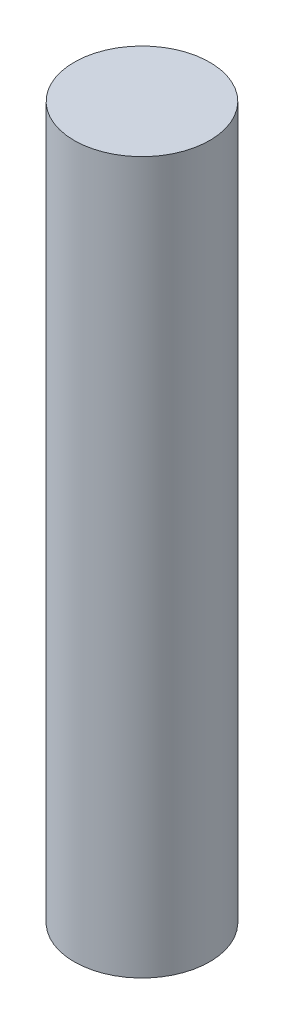
ISO-10303-21;
HEADER;
FILE_DESCRIPTION(('STEP AP214'),'2;1');
FILE_NAME('part.step','',(''),(''),'','','');
FILE_SCHEMA(('AUTOMOTIVE_DESIGN { 1 0 10303 214 1 1 1 1 }'));
ENDSEC;
DATA;
#1=APPLICATION_CONTEXT('core data for automotive mechanical design processes');
#2=APPLICATION_PROTOCOL_DEFINITION('international standard','automotive_design',2000,#1);
#3=PRODUCT_CONTEXT('',#1,'mechanical');
#4=PRODUCT('Part','Part','',(#3));
#5=PRODUCT_RELATED_PRODUCT_CATEGORY('part','',(#4));
#6=PRODUCT_DEFINITION_FORMATION('','',#4);
#7=PRODUCT_DEFINITION_CONTEXT('part definition',#1,'design');
#8=PRODUCT_DEFINITION('design','',#6,#7);
#9=PRODUCT_DEFINITION_SHAPE('','',#8);
#10=(LENGTH_UNIT() NAMED_UNIT(*) SI_UNIT(.MILLI.,.METRE.));
#11=(NAMED_UNIT(*) PLANE_ANGLE_UNIT() SI_UNIT($,.RADIAN.));
#12=(NAMED_UNIT(*) SI_UNIT($,.STERADIAN.) SOLID_ANGLE_UNIT());
#13=UNCERTAINTY_MEASURE_WITH_UNIT(LENGTH_MEASURE(1.E-05),#10,'distance_accuracy_value','');
#14=(GEOMETRIC_REPRESENTATION_CONTEXT(3) GLOBAL_UNCERTAINTY_ASSIGNED_CONTEXT((#13)) GLOBAL_UNIT_ASSIGNED_CONTEXT((#10,
#11,#12)) REPRESENTATION_CONTEXT('',''));
#15=CARTESIAN_POINT('',(0.,0.,0.));
#16=DIRECTION('',(0.,0.,1.));
#17=DIRECTION('',(1.,0.,0.));
#18=AXIS2_PLACEMENT_3D('',#15,#16,#17);
#19=CARTESIAN_POINT('',(0.,9.34,0.));
#20=DIRECTION('',(0.,-1.,0.));
#21=DIRECTION('',(0.,0.,-1.));
#22=AXIS2_PLACEMENT_3D('',#19,#20,#21);
#23=CYLINDRICAL_SURFACE('',#22,0.89);
#24=CARTESIAN_POINT('',(0.,9.34,0.));
#25=DIRECTION('',(0.,1.,0.));
#26=DIRECTION('',(0.,0.,1.));
#27=AXIS2_PLACEMENT_3D('',#24,#25,#26);
#28=CIRCLE('',#27,0.89);
#29=CARTESIAN_POINT('',(0.,9.34,0.89));
#30=VERTEX_POINT('',#29);
#31=EDGE_CURVE('E10',#30,#30,#28,.T.);
#32=ORIENTED_EDGE('',*,*,#31,.F.);
#33=EDGE_LOOP('',(#32));
#34=FACE_BOUND('',#33,.T.);
#35=CARTESIAN_POINT('',(0.,0.,0.));
#36=DIRECTION('',(0.,1.,0.));
#37=DIRECTION('',(0.,0.,1.));
#38=AXIS2_PLACEMENT_3D('',#35,#36,#37);
#39=CIRCLE('',#38,0.89);
#40=CARTESIAN_POINT('',(0.,0.,0.89));
#41=VERTEX_POINT('',#40);
#42=EDGE_CURVE('E46',#41,#41,#39,.T.);
#43=ORIENTED_EDGE('',*,*,#42,.T.);
#44=EDGE_LOOP('',(#43));
#45=FACE_BOUND('',#44,.T.);
#46=ADVANCED_FACE('F43',(#34,#45),#23,.T.);
#47=CARTESIAN_POINT('',(0.,9.34,0.));
#48=DIRECTION('',(0.,1.,0.));
#49=DIRECTION('',(0.,0.,1.));
#50=AXIS2_PLACEMENT_3D('',#47,#48,#49);
#51=PLANE('',#50);
#52=ORIENTED_EDGE('',*,*,#31,.T.);
#53=EDGE_LOOP('',(#52));
#54=FACE_BOUND('',#53,.T.);
#55=ADVANCED_FACE('F60',(#54),#51,.T.);
#56=CARTESIAN_POINT('',(0.,0.,0.));
#57=DIRECTION('',(0.,1.,0.));
#58=DIRECTION('',(0.,0.,1.));
#59=AXIS2_PLACEMENT_3D('',#56,#57,#58);
#60=PLANE('',#59);
#61=ORIENTED_EDGE('',*,*,#42,.F.);
#62=EDGE_LOOP('',(#61));
#63=FACE_BOUND('',#62,.T.);
#64=ADVANCED_FACE('F58',(#63),#60,.F.);
#65=CLOSED_SHELL('',(#46,#55,#64));
#66=MANIFOLD_SOLID_BREP('B2',#65);
#67=ADVANCED_BREP_SHAPE_REPRESENTATION('',(#18,#66),#14);
#68=SHAPE_DEFINITION_REPRESENTATION(#9,#67);
ENDSEC;
END-ISO-10303-21;
